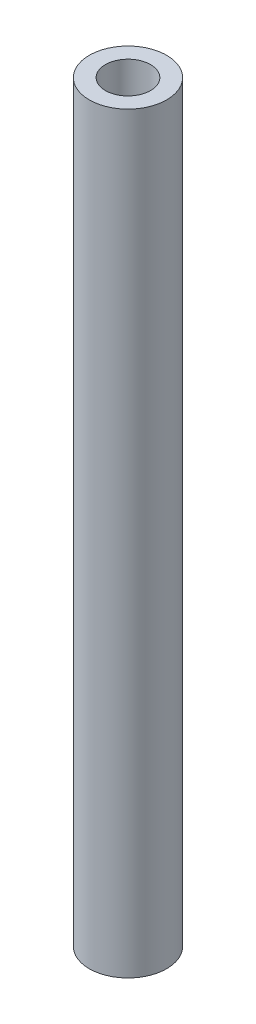
ISO-10303-21;
HEADER;
FILE_DESCRIPTION(('STEP AP214'),'2;1');
FILE_NAME('part.step','',(''),(''),'','','');
FILE_SCHEMA(('AUTOMOTIVE_DESIGN { 1 0 10303 214 1 1 1 1 }'));
ENDSEC;
DATA;
#1=APPLICATION_CONTEXT('core data for automotive mechanical design processes');
#2=APPLICATION_PROTOCOL_DEFINITION('international standard','automotive_design',2000,#1);
#3=PRODUCT_CONTEXT('',#1,'mechanical');
#4=PRODUCT('Part','Part','',(#3));
#5=PRODUCT_RELATED_PRODUCT_CATEGORY('part','',(#4));
#6=PRODUCT_DEFINITION_FORMATION('','',#4);
#7=PRODUCT_DEFINITION_CONTEXT('part definition',#1,'design');
#8=PRODUCT_DEFINITION('design','',#6,#7);
#9=PRODUCT_DEFINITION_SHAPE('','',#8);
#10=(LENGTH_UNIT() NAMED_UNIT(*) SI_UNIT(.MILLI.,.METRE.));
#11=(NAMED_UNIT(*) PLANE_ANGLE_UNIT() SI_UNIT($,.RADIAN.));
#12=(NAMED_UNIT(*) SI_UNIT($,.STERADIAN.) SOLID_ANGLE_UNIT());
#13=UNCERTAINTY_MEASURE_WITH_UNIT(LENGTH_MEASURE(1.E-05),#10,'distance_accuracy_value','');
#14=(GEOMETRIC_REPRESENTATION_CONTEXT(3) GLOBAL_UNCERTAINTY_ASSIGNED_CONTEXT((#13)) GLOBAL_UNIT_ASSIGNED_CONTEXT((#10,
#11,#12)) REPRESENTATION_CONTEXT('',''));
#15=CARTESIAN_POINT('',(0.,0.,0.));
#16=DIRECTION('',(0.,0.,1.));
#17=DIRECTION('',(1.,0.,0.));
#18=AXIS2_PLACEMENT_3D('',#15,#16,#17);
#19=CARTESIAN_POINT('',(0.,118.618,0.));
#20=DIRECTION('',(0.,1.,0.));
#21=DIRECTION('',(0.,0.,1.));
#22=AXIS2_PLACEMENT_3D('',#19,#20,#21);
#23=PLANE('',#22);
#24=CARTESIAN_POINT('',(0.,118.618,0.));
#25=DIRECTION('',(0.,1.,0.));
#26=DIRECTION('',(0.,0.,1.));
#27=AXIS2_PLACEMENT_3D('',#24,#25,#26);
#28=CIRCLE('',#27,6.096);
#29=CARTESIAN_POINT('',(0.,118.618,6.096));
#30=VERTEX_POINT('',#29);
#31=EDGE_CURVE('E10',#30,#30,#28,.T.);
#32=ORIENTED_EDGE('',*,*,#31,.T.);
#33=EDGE_LOOP('',(#32));
#34=FACE_BOUND('',#33,.T.);
#35=CARTESIAN_POINT('',(0.,118.618,0.));
#36=DIRECTION('',(0.,1.,0.));
#37=DIRECTION('',(0.,0.,1.));
#38=AXIS2_PLACEMENT_3D('',#35,#36,#37);
#39=CIRCLE('',#38,3.556);
#40=CARTESIAN_POINT('',(0.,118.618,3.556));
#41=VERTEX_POINT('',#40);
#42=EDGE_CURVE('E42',#41,#41,#39,.T.);
#43=ORIENTED_EDGE('',*,*,#42,.F.);
#44=EDGE_LOOP('',(#43));
#45=FACE_BOUND('',#44,.T.);
#46=ADVANCED_FACE('F31',(#34,#45),#23,.T.);
#47=CARTESIAN_POINT('',(0.,0.,0.));
#48=DIRECTION('',(0.,1.,0.));
#49=DIRECTION('',(0.,0.,1.));
#50=AXIS2_PLACEMENT_3D('',#47,#48,#49);
#51=PLANE('',#50);
#52=CARTESIAN_POINT('',(0.,0.,0.));
#53=DIRECTION('',(0.,1.,0.));
#54=DIRECTION('',(0.,0.,1.));
#55=AXIS2_PLACEMENT_3D('',#52,#53,#54);
#56=CIRCLE('',#55,6.096);
#57=CARTESIAN_POINT('',(0.,0.,6.096));
#58=VERTEX_POINT('',#57);
#59=EDGE_CURVE('E35',#58,#58,#56,.T.);
#60=ORIENTED_EDGE('',*,*,#59,.F.);
#61=EDGE_LOOP('',(#60));
#62=FACE_BOUND('',#61,.T.);
#63=CARTESIAN_POINT('',(0.,0.,0.));
#64=DIRECTION('',(0.,1.,0.));
#65=DIRECTION('',(0.,0.,1.));
#66=AXIS2_PLACEMENT_3D('',#63,#64,#65);
#67=CIRCLE('',#66,3.556);
#68=CARTESIAN_POINT('',(0.,0.,3.556));
#69=VERTEX_POINT('',#68);
#70=EDGE_CURVE('E44',#69,#69,#67,.T.);
#71=ORIENTED_EDGE('',*,*,#70,.T.);
#72=EDGE_LOOP('',(#71));
#73=FACE_BOUND('',#72,.T.);
#74=ADVANCED_FACE('F54',(#62,#73),#51,.F.);
#75=CARTESIAN_POINT('',(0.,118.618,0.));
#76=DIRECTION('',(0.,-1.,0.));
#77=DIRECTION('',(0.,0.,-1.));
#78=AXIS2_PLACEMENT_3D('',#75,#76,#77);
#79=CYLINDRICAL_SURFACE('',#78,6.096);
#80=ORIENTED_EDGE('',*,*,#31,.F.);
#81=EDGE_LOOP('',(#80));
#82=FACE_BOUND('',#81,.T.);
#83=ORIENTED_EDGE('',*,*,#59,.T.);
#84=EDGE_LOOP('',(#83));
#85=FACE_BOUND('',#84,.T.);
#86=ADVANCED_FACE('F33',(#82,#85),#79,.T.);
#87=CARTESIAN_POINT('',(0.,118.618,0.));
#88=DIRECTION('',(0.,-1.,0.));
#89=DIRECTION('',(0.,0.,-1.));
#90=AXIS2_PLACEMENT_3D('',#87,#88,#89);
#91=CYLINDRICAL_SURFACE('',#90,3.556);
#92=ORIENTED_EDGE('',*,*,#42,.T.);
#93=EDGE_LOOP('',(#92));
#94=FACE_BOUND('',#93,.T.);
#95=ORIENTED_EDGE('',*,*,#70,.F.);
#96=EDGE_LOOP('',(#95));
#97=FACE_BOUND('',#96,.T.);
#98=ADVANCED_FACE('F50',(#94,#97),#91,.F.);
#99=CLOSED_SHELL('',(#46,#74,#86,#98));
#100=MANIFOLD_SOLID_BREP('B2',#99);
#101=ADVANCED_BREP_SHAPE_REPRESENTATION('',(#18,#100),#14);
#102=SHAPE_DEFINITION_REPRESENTATION(#9,#101);
ENDSEC;
END-ISO-10303-21;
